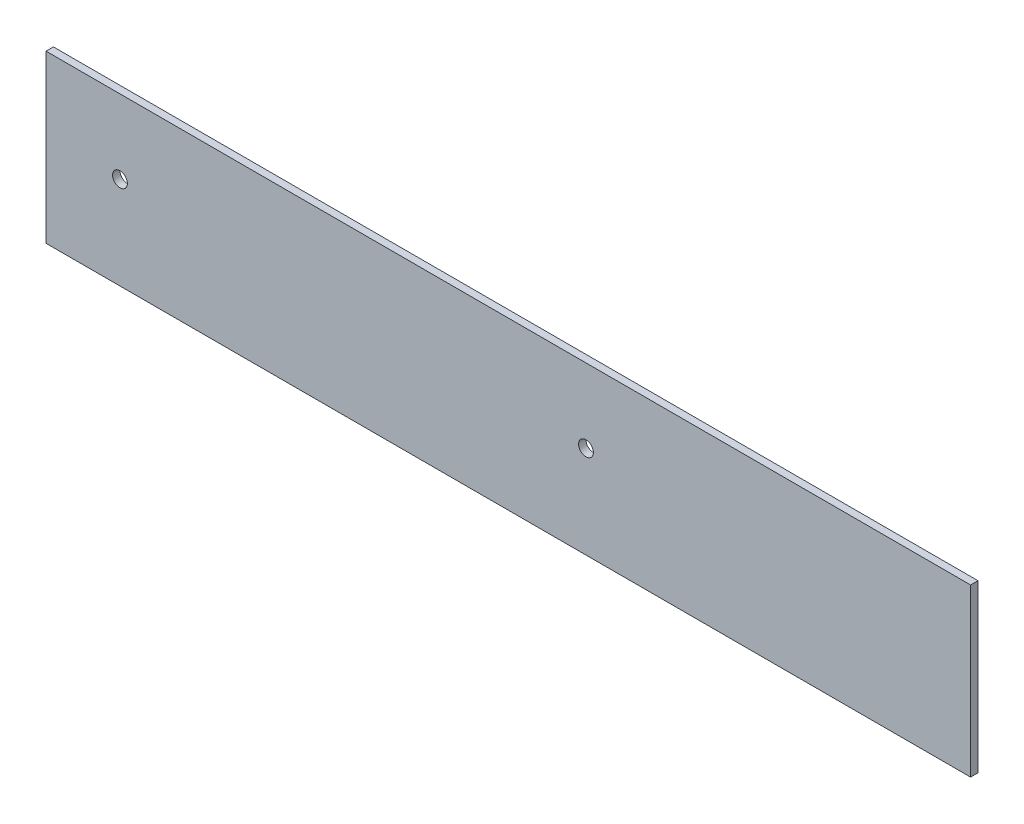
ISO-10303-21;
HEADER;
FILE_DESCRIPTION(('STEP AP214'),'2;1');
FILE_NAME('part.step','',(''),(''),'','','');
FILE_SCHEMA(('AUTOMOTIVE_DESIGN { 1 0 10303 214 1 1 1 1 }'));
ENDSEC;
DATA;
#1=APPLICATION_CONTEXT('core data for automotive mechanical design processes');
#2=APPLICATION_PROTOCOL_DEFINITION('international standard','automotive_design',2000,#1);
#3=PRODUCT_CONTEXT('',#1,'mechanical');
#4=PRODUCT('Part','Part','',(#3));
#5=PRODUCT_RELATED_PRODUCT_CATEGORY('part','',(#4));
#6=PRODUCT_DEFINITION_FORMATION('','',#4);
#7=PRODUCT_DEFINITION_CONTEXT('part definition',#1,'design');
#8=PRODUCT_DEFINITION('design','',#6,#7);
#9=PRODUCT_DEFINITION_SHAPE('','',#8);
#10=(LENGTH_UNIT() NAMED_UNIT(*) SI_UNIT(.MILLI.,.METRE.));
#11=(NAMED_UNIT(*) PLANE_ANGLE_UNIT() SI_UNIT($,.RADIAN.));
#12=(NAMED_UNIT(*) SI_UNIT($,.STERADIAN.) SOLID_ANGLE_UNIT());
#13=UNCERTAINTY_MEASURE_WITH_UNIT(LENGTH_MEASURE(1.E-05),#10,'distance_accuracy_value','');
#14=(GEOMETRIC_REPRESENTATION_CONTEXT(3) GLOBAL_UNCERTAINTY_ASSIGNED_CONTEXT((#13)) GLOBAL_UNIT_ASSIGNED_CONTEXT((#10,
#11,#12)) REPRESENTATION_CONTEXT('',''));
#15=CARTESIAN_POINT('',(0.,0.,0.));
#16=DIRECTION('',(0.,0.,1.));
#17=DIRECTION('',(1.,0.,0.));
#18=AXIS2_PLACEMENT_3D('',#15,#16,#17);
#19=CARTESIAN_POINT('',(125.,22.5,2.));
#20=DIRECTION('',(-1.,0.,0.));
#21=DIRECTION('',(0.,0.,1.));
#22=AXIS2_PLACEMENT_3D('',#19,#20,#21);
#23=PLANE('',#22);
#24=DIRECTION('',(0.,1.,0.));
#25=VECTOR('',#24,1.);
#26=CARTESIAN_POINT('',(125.,22.5,0.));
#27=LINE('',#26,#25);
#28=CARTESIAN_POINT('',(125.,-22.5,0.));
#29=VERTEX_POINT('',#28);
#30=CARTESIAN_POINT('',(125.,22.5,0.));
#31=VERTEX_POINT('',#30);
#32=EDGE_CURVE('E100',#29,#31,#27,.T.);
#33=ORIENTED_EDGE('',*,*,#32,.T.);
#34=DIRECTION('',(0.,0.,-1.));
#35=VECTOR('',#34,1.);
#36=CARTESIAN_POINT('',(125.,22.5,2.));
#37=LINE('',#36,#35);
#38=CARTESIAN_POINT('',(125.,22.5,2.));
#39=VERTEX_POINT('',#38);
#40=EDGE_CURVE('E11',#39,#31,#37,.T.);
#41=ORIENTED_EDGE('',*,*,#40,.F.);
#42=DIRECTION('',(0.,1.,0.));
#43=VECTOR('',#42,1.);
#44=CARTESIAN_POINT('',(125.,22.5,2.));
#45=LINE('',#44,#43);
#46=CARTESIAN_POINT('',(125.,-22.5,2.));
#47=VERTEX_POINT('',#46);
#48=EDGE_CURVE('E87',#47,#39,#45,.T.);
#49=ORIENTED_EDGE('',*,*,#48,.F.);
#50=DIRECTION('',(0.,0.,-1.));
#51=VECTOR('',#50,1.);
#52=CARTESIAN_POINT('',(125.,-22.5,2.));
#53=LINE('',#52,#51);
#54=EDGE_CURVE('E96',#47,#29,#53,.T.);
#55=ORIENTED_EDGE('',*,*,#54,.T.);
#56=EDGE_LOOP('',(#33,#41,#49,#55));
#57=FACE_BOUND('',#56,.T.);
#58=ADVANCED_FACE('F34',(#57),#23,.F.);
#59=CARTESIAN_POINT('',(-125.,22.5,2.));
#60=DIRECTION('',(0.,-1.,0.));
#61=DIRECTION('',(0.,0.,-1.));
#62=AXIS2_PLACEMENT_3D('',#59,#60,#61);
#63=PLANE('',#62);
#64=DIRECTION('',(-1.,0.,0.));
#65=VECTOR('',#64,1.);
#66=CARTESIAN_POINT('',(-125.,22.5,0.));
#67=LINE('',#66,#65);
#68=CARTESIAN_POINT('',(-125.,22.5,0.));
#69=VERTEX_POINT('',#68);
#70=EDGE_CURVE('E91',#31,#69,#67,.T.);
#71=ORIENTED_EDGE('',*,*,#70,.T.);
#72=DIRECTION('',(0.,0.,-1.));
#73=VECTOR('',#72,1.);
#74=CARTESIAN_POINT('',(-125.,22.5,2.));
#75=LINE('',#74,#73);
#76=CARTESIAN_POINT('',(-125.,22.5,2.));
#77=VERTEX_POINT('',#76);
#78=EDGE_CURVE('E43',#77,#69,#75,.T.);
#79=ORIENTED_EDGE('',*,*,#78,.F.);
#80=DIRECTION('',(-1.,0.,0.));
#81=VECTOR('',#80,1.);
#82=CARTESIAN_POINT('',(-125.,22.5,2.));
#83=LINE('',#82,#81);
#84=EDGE_CURVE('E82',#39,#77,#83,.T.);
#85=ORIENTED_EDGE('',*,*,#84,.F.);
#86=ORIENTED_EDGE('',*,*,#40,.T.);
#87=EDGE_LOOP('',(#71,#79,#85,#86));
#88=FACE_BOUND('',#87,.T.);
#89=ADVANCED_FACE('F90',(#88),#63,.F.);
#90=CARTESIAN_POINT('',(-125.,22.5,2.));
#91=DIRECTION('',(1.,0.,0.));
#92=DIRECTION('',(0.,0.,-1.));
#93=AXIS2_PLACEMENT_3D('',#90,#91,#92);
#94=PLANE('',#93);
#95=DIRECTION('',(0.,-1.,0.));
#96=VECTOR('',#95,1.);
#97=CARTESIAN_POINT('',(-125.,22.5,0.));
#98=LINE('',#97,#96);
#99=CARTESIAN_POINT('',(-125.,-22.5,0.));
#100=VERTEX_POINT('',#99);
#101=EDGE_CURVE('E69',#69,#100,#98,.T.);
#102=ORIENTED_EDGE('',*,*,#101,.T.);
#103=DIRECTION('',(0.,0.,-1.));
#104=VECTOR('',#103,1.);
#105=CARTESIAN_POINT('',(-125.,-22.5,2.));
#106=LINE('',#105,#104);
#107=CARTESIAN_POINT('',(-125.,-22.5,2.));
#108=VERTEX_POINT('',#107);
#109=EDGE_CURVE('E92',#108,#100,#106,.T.);
#110=ORIENTED_EDGE('',*,*,#109,.F.);
#111=DIRECTION('',(0.,-1.,0.));
#112=VECTOR('',#111,1.);
#113=CARTESIAN_POINT('',(-125.,22.5,2.));
#114=LINE('',#113,#112);
#115=EDGE_CURVE('E85',#77,#108,#114,.T.);
#116=ORIENTED_EDGE('',*,*,#115,.F.);
#117=ORIENTED_EDGE('',*,*,#78,.T.);
#118=EDGE_LOOP('',(#102,#110,#116,#117));
#119=FACE_BOUND('',#118,.T.);
#120=ADVANCED_FACE('F94',(#119),#94,.F.);
#121=CARTESIAN_POINT('',(-125.,-22.5,2.));
#122=DIRECTION('',(0.,1.,0.));
#123=DIRECTION('',(0.,0.,1.));
#124=AXIS2_PLACEMENT_3D('',#121,#122,#123);
#125=PLANE('',#124);
#126=DIRECTION('',(1.,0.,0.));
#127=VECTOR('',#126,1.);
#128=CARTESIAN_POINT('',(-125.,-22.5,0.));
#129=LINE('',#128,#127);
#130=EDGE_CURVE('E75',#100,#29,#129,.T.);
#131=ORIENTED_EDGE('',*,*,#130,.T.);
#132=ORIENTED_EDGE('',*,*,#54,.F.);
#133=DIRECTION('',(1.,0.,0.));
#134=VECTOR('',#133,1.);
#135=CARTESIAN_POINT('',(-125.,-22.5,2.));
#136=LINE('',#135,#134);
#137=EDGE_CURVE('E52',#108,#47,#136,.T.);
#138=ORIENTED_EDGE('',*,*,#137,.F.);
#139=ORIENTED_EDGE('',*,*,#109,.T.);
#140=EDGE_LOOP('',(#131,#132,#138,#139));
#141=FACE_BOUND('',#140,.T.);
#142=ADVANCED_FACE('F126',(#141),#125,.F.);
#143=CARTESIAN_POINT('',(0.,0.,2.));
#144=DIRECTION('',(0.,0.,1.));
#145=DIRECTION('',(1.,0.,0.));
#146=AXIS2_PLACEMENT_3D('',#143,#144,#145);
#147=PLANE('',#146);
#148=CARTESIAN_POINT('',(-105.,2.50000000000001,2.));
#149=DIRECTION('',(0.,0.,1.));
#150=DIRECTION('',(1.,0.,0.));
#151=AXIS2_PLACEMENT_3D('',#148,#149,#150);
#152=CIRCLE('',#151,2.);
#153=CARTESIAN_POINT('',(-103.,2.50000000000001,2.));
#154=VERTEX_POINT('',#153);
#155=EDGE_CURVE('E109',#154,#154,#152,.T.);
#156=ORIENTED_EDGE('',*,*,#155,.F.);
#157=EDGE_LOOP('',(#156));
#158=FACE_BOUND('',#157,.T.);
#159=CARTESIAN_POINT('',(21.,2.50000000000001,2.));
#160=DIRECTION('',(0.,0.,1.));
#161=DIRECTION('',(1.,0.,0.));
#162=AXIS2_PLACEMENT_3D('',#159,#160,#161);
#163=CIRCLE('',#162,2.);
#164=CARTESIAN_POINT('',(23.,2.50000000000001,2.));
#165=VERTEX_POINT('',#164);
#166=EDGE_CURVE('E114',#165,#165,#163,.T.);
#167=ORIENTED_EDGE('',*,*,#166,.F.);
#168=EDGE_LOOP('',(#167));
#169=FACE_BOUND('',#168,.T.);
#170=ORIENTED_EDGE('',*,*,#48,.T.);
#171=ORIENTED_EDGE('',*,*,#84,.T.);
#172=ORIENTED_EDGE('',*,*,#115,.T.);
#173=ORIENTED_EDGE('',*,*,#137,.T.);
#174=EDGE_LOOP('',(#170,#171,#172,#173));
#175=FACE_BOUND('',#174,.T.);
#176=ADVANCED_FACE('F83',(#158,#169,#175),#147,.T.);
#177=CARTESIAN_POINT('',(0.,0.,0.));
#178=DIRECTION('',(0.,0.,1.));
#179=DIRECTION('',(1.,0.,0.));
#180=AXIS2_PLACEMENT_3D('',#177,#178,#179);
#181=PLANE('',#180);
#182=CARTESIAN_POINT('',(-105.,2.50000000000001,0.));
#183=DIRECTION('',(0.,0.,1.));
#184=DIRECTION('',(1.,0.,0.));
#185=AXIS2_PLACEMENT_3D('',#182,#183,#184);
#186=CIRCLE('',#185,2.);
#187=CARTESIAN_POINT('',(-103.,2.50000000000001,0.));
#188=VERTEX_POINT('',#187);
#189=EDGE_CURVE('E37',#188,#188,#186,.F.);
#190=ORIENTED_EDGE('',*,*,#189,.F.);
#191=EDGE_LOOP('',(#190));
#192=FACE_BOUND('',#191,.T.);
#193=CARTESIAN_POINT('',(21.,2.50000000000001,0.));
#194=DIRECTION('',(0.,0.,1.));
#195=DIRECTION('',(1.,0.,0.));
#196=AXIS2_PLACEMENT_3D('',#193,#194,#195);
#197=CIRCLE('',#196,2.);
#198=CARTESIAN_POINT('',(23.,2.50000000000001,0.));
#199=VERTEX_POINT('',#198);
#200=EDGE_CURVE('E107',#199,#199,#197,.F.);
#201=ORIENTED_EDGE('',*,*,#200,.F.);
#202=EDGE_LOOP('',(#201));
#203=FACE_BOUND('',#202,.T.);
#204=ORIENTED_EDGE('',*,*,#32,.F.);
#205=ORIENTED_EDGE('',*,*,#130,.F.);
#206=ORIENTED_EDGE('',*,*,#101,.F.);
#207=ORIENTED_EDGE('',*,*,#70,.F.);
#208=EDGE_LOOP('',(#204,#205,#206,#207));
#209=FACE_BOUND('',#208,.T.);
#210=ADVANCED_FACE('F125',(#192,#203,#209),#181,.F.);
#211=CARTESIAN_POINT('',(21.,2.50000000000001,2.));
#212=DIRECTION('',(0.,0.,-1.));
#213=DIRECTION('',(-1.,0.,0.));
#214=AXIS2_PLACEMENT_3D('',#211,#212,#213);
#215=CYLINDRICAL_SURFACE('',#214,2.);
#216=ORIENTED_EDGE('',*,*,#166,.T.);
#217=EDGE_LOOP('',(#216));
#218=FACE_BOUND('',#217,.T.);
#219=ORIENTED_EDGE('',*,*,#200,.T.);
#220=EDGE_LOOP('',(#219));
#221=FACE_BOUND('',#220,.T.);
#222=ADVANCED_FACE('F122',(#218,#221),#215,.F.);
#223=CARTESIAN_POINT('',(-105.,2.50000000000001,2.));
#224=DIRECTION('',(0.,0.,-1.));
#225=DIRECTION('',(-1.,0.,0.));
#226=AXIS2_PLACEMENT_3D('',#223,#224,#225);
#227=CYLINDRICAL_SURFACE('',#226,2.);
#228=ORIENTED_EDGE('',*,*,#155,.T.);
#229=EDGE_LOOP('',(#228));
#230=FACE_BOUND('',#229,.T.);
#231=ORIENTED_EDGE('',*,*,#189,.T.);
#232=EDGE_LOOP('',(#231));
#233=FACE_BOUND('',#232,.T.);
#234=ADVANCED_FACE('F173',(#230,#233),#227,.F.);
#235=CLOSED_SHELL('',(#58,#89,#120,#142,#176,#210,#222,#234));
#236=MANIFOLD_SOLID_BREP('B2',#235);
#237=ADVANCED_BREP_SHAPE_REPRESENTATION('',(#18,#236),#14);
#238=SHAPE_DEFINITION_REPRESENTATION(#9,#237);
ENDSEC;
END-ISO-10303-21;
